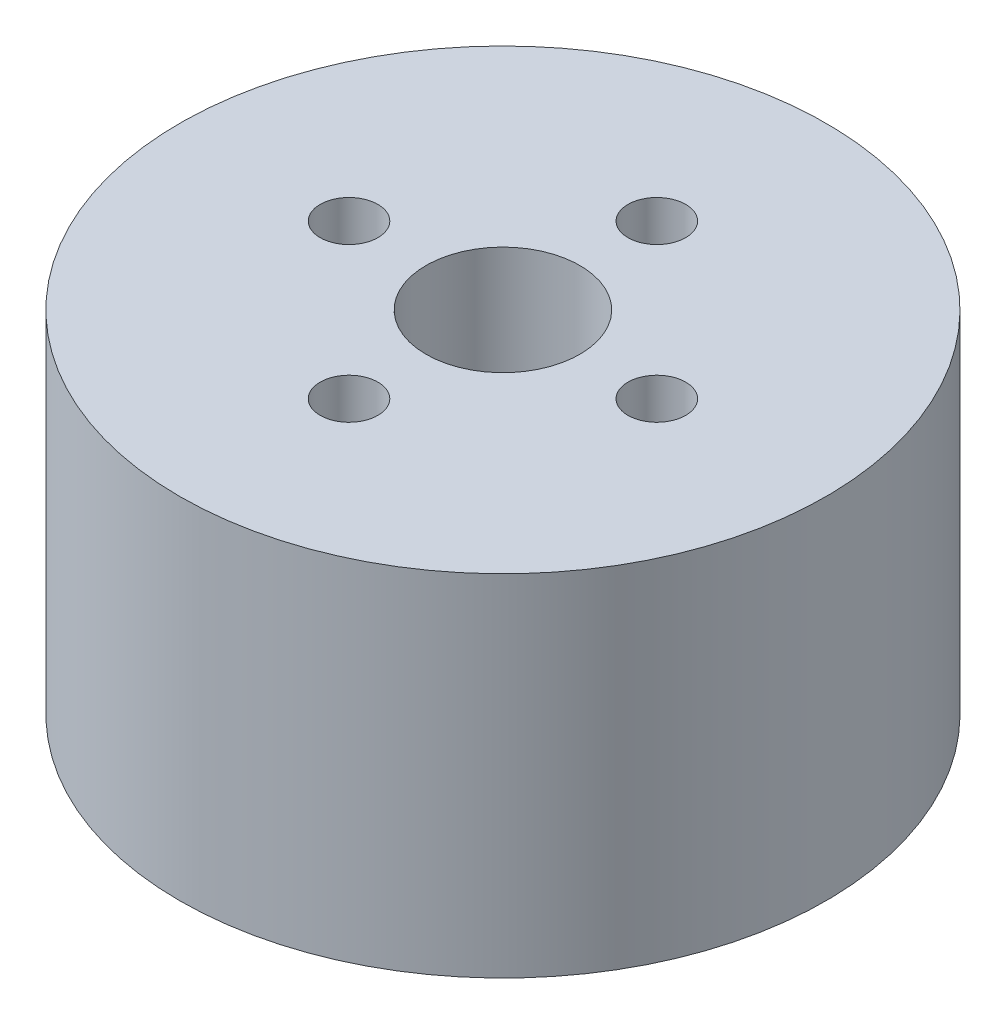
ISO-10303-21;
HEADER;
FILE_DESCRIPTION(('STEP AP214'),'2;1');
FILE_NAME('part.step','',(''),(''),'','','');
FILE_SCHEMA(('AUTOMOTIVE_DESIGN { 1 0 10303 214 1 1 1 1 }'));
ENDSEC;
DATA;
#1=APPLICATION_CONTEXT('core data for automotive mechanical design processes');
#2=APPLICATION_PROTOCOL_DEFINITION('international standard','automotive_design',2000,#1);
#3=PRODUCT_CONTEXT('',#1,'mechanical');
#4=PRODUCT('Part','Part','',(#3));
#5=PRODUCT_RELATED_PRODUCT_CATEGORY('part','',(#4));
#6=PRODUCT_DEFINITION_FORMATION('','',#4);
#7=PRODUCT_DEFINITION_CONTEXT('part definition',#1,'design');
#8=PRODUCT_DEFINITION('design','',#6,#7);
#9=PRODUCT_DEFINITION_SHAPE('','',#8);
#10=(LENGTH_UNIT() NAMED_UNIT(*) SI_UNIT(.MILLI.,.METRE.));
#11=(NAMED_UNIT(*) PLANE_ANGLE_UNIT() SI_UNIT($,.RADIAN.));
#12=(NAMED_UNIT(*) SI_UNIT($,.STERADIAN.) SOLID_ANGLE_UNIT());
#13=UNCERTAINTY_MEASURE_WITH_UNIT(LENGTH_MEASURE(1.E-05),#10,'distance_accuracy_value','');
#14=(GEOMETRIC_REPRESENTATION_CONTEXT(3) GLOBAL_UNCERTAINTY_ASSIGNED_CONTEXT((#13)) GLOBAL_UNIT_ASSIGNED_CONTEXT((#10,
#11,#12)) REPRESENTATION_CONTEXT('',''));
#15=CARTESIAN_POINT('',(0.,0.,0.));
#16=DIRECTION('',(0.,0.,1.));
#17=DIRECTION('',(1.,0.,0.));
#18=AXIS2_PLACEMENT_3D('',#15,#16,#17);
#19=CARTESIAN_POINT('',(0.,18.2,0.));
#20=DIRECTION('',(0.,-1.,0.));
#21=DIRECTION('',(0.,0.,-1.));
#22=AXIS2_PLACEMENT_3D('',#19,#20,#21);
#23=CYLINDRICAL_SURFACE('',#22,16.8);
#24=CARTESIAN_POINT('',(0.,18.2,0.));
#25=DIRECTION('',(0.,1.,0.));
#26=DIRECTION('',(0.,0.,1.));
#27=AXIS2_PLACEMENT_3D('',#24,#25,#26);
#28=CIRCLE('',#27,16.8);
#29=CARTESIAN_POINT('',(0.,18.2,16.8));
#30=VERTEX_POINT('',#29);
#31=EDGE_CURVE('E10',#30,#30,#28,.T.);
#32=ORIENTED_EDGE('',*,*,#31,.F.);
#33=EDGE_LOOP('',(#32));
#34=FACE_BOUND('',#33,.T.);
#35=CARTESIAN_POINT('',(0.,0.,0.));
#36=DIRECTION('',(0.,1.,0.));
#37=DIRECTION('',(0.,0.,1.));
#38=AXIS2_PLACEMENT_3D('',#35,#36,#37);
#39=CIRCLE('',#38,16.8);
#40=CARTESIAN_POINT('',(0.,0.,16.8));
#41=VERTEX_POINT('',#40);
#42=EDGE_CURVE('E40',#41,#41,#39,.T.);
#43=ORIENTED_EDGE('',*,*,#42,.T.);
#44=EDGE_LOOP('',(#43));
#45=FACE_BOUND('',#44,.T.);
#46=ADVANCED_FACE('F37',(#34,#45),#23,.T.);
#47=CARTESIAN_POINT('',(0.,18.2,0.));
#48=DIRECTION('',(0.,1.,0.));
#49=DIRECTION('',(0.,0.,1.));
#50=AXIS2_PLACEMENT_3D('',#47,#48,#49);
#51=PLANE('',#50);
#52=CARTESIAN_POINT('',(0.,18.2,-8.));
#53=DIRECTION('',(0.,1.,0.));
#54=DIRECTION('',(0.,0.,1.));
#55=AXIS2_PLACEMENT_3D('',#52,#53,#54);
#56=CIRCLE('',#55,1.5);
#57=CARTESIAN_POINT('',(0.,18.2,-6.5));
#58=VERTEX_POINT('',#57);
#59=EDGE_CURVE('E74',#58,#58,#56,.T.);
#60=ORIENTED_EDGE('',*,*,#59,.F.);
#61=EDGE_LOOP('',(#60));
#62=FACE_BOUND('',#61,.T.);
#63=CARTESIAN_POINT('',(8.,18.2,0.));
#64=DIRECTION('',(0.,1.,0.));
#65=DIRECTION('',(0.,0.,1.));
#66=AXIS2_PLACEMENT_3D('',#63,#64,#65);
#67=CIRCLE('',#66,1.5);
#68=CARTESIAN_POINT('',(8.,18.2,1.5));
#69=VERTEX_POINT('',#68);
#70=EDGE_CURVE('E68',#69,#69,#67,.T.);
#71=ORIENTED_EDGE('',*,*,#70,.F.);
#72=EDGE_LOOP('',(#71));
#73=FACE_BOUND('',#72,.T.);
#74=CARTESIAN_POINT('',(0.,18.2,8.));
#75=DIRECTION('',(0.,1.,0.));
#76=DIRECTION('',(0.,0.,1.));
#77=AXIS2_PLACEMENT_3D('',#74,#75,#76);
#78=CIRCLE('',#77,1.5);
#79=CARTESIAN_POINT('',(0.,18.2,9.5));
#80=VERTEX_POINT('',#79);
#81=EDGE_CURVE('E62',#80,#80,#78,.T.);
#82=ORIENTED_EDGE('',*,*,#81,.F.);
#83=EDGE_LOOP('',(#82));
#84=FACE_BOUND('',#83,.T.);
#85=CARTESIAN_POINT('',(-8.,18.2,0.));
#86=DIRECTION('',(0.,1.,0.));
#87=DIRECTION('',(0.,0.,1.));
#88=AXIS2_PLACEMENT_3D('',#85,#86,#87);
#89=CIRCLE('',#88,1.5);
#90=CARTESIAN_POINT('',(-8.,18.2,1.5));
#91=VERTEX_POINT('',#90);
#92=EDGE_CURVE('E55',#91,#91,#89,.T.);
#93=ORIENTED_EDGE('',*,*,#92,.F.);
#94=EDGE_LOOP('',(#93));
#95=FACE_BOUND('',#94,.T.);
#96=CARTESIAN_POINT('',(0.,18.2,0.));
#97=DIRECTION('',(0.,1.,0.));
#98=DIRECTION('',(0.,0.,1.));
#99=AXIS2_PLACEMENT_3D('',#96,#97,#98);
#100=CIRCLE('',#99,4.);
#101=CARTESIAN_POINT('',(0.,18.2,4.));
#102=VERTEX_POINT('',#101);
#103=EDGE_CURVE('E49',#102,#102,#100,.T.);
#104=ORIENTED_EDGE('',*,*,#103,.F.);
#105=EDGE_LOOP('',(#104));
#106=FACE_BOUND('',#105,.T.);
#107=ORIENTED_EDGE('',*,*,#31,.T.);
#108=EDGE_LOOP('',(#107));
#109=FACE_BOUND('',#108,.T.);
#110=ADVANCED_FACE('F116',(#62,#73,#84,#95,#106,#109),#51,.T.);
#111=CARTESIAN_POINT('',(0.,0.,0.));
#112=DIRECTION('',(0.,1.,0.));
#113=DIRECTION('',(0.,0.,1.));
#114=AXIS2_PLACEMENT_3D('',#111,#112,#113);
#115=PLANE('',#114);
#116=CARTESIAN_POINT('',(0.,0.,11.25));
#117=DIRECTION('',(0.,-1.,0.));
#118=DIRECTION('',(0.,0.,-1.));
#119=AXIS2_PLACEMENT_3D('',#116,#117,#118);
#120=CIRCLE('',#119,1.5);
#121=CARTESIAN_POINT('',(0.,0.,9.75));
#122=VERTEX_POINT('',#121);
#123=EDGE_CURVE('E97',#122,#122,#120,.T.);
#124=ORIENTED_EDGE('',*,*,#123,.F.);
#125=EDGE_LOOP('',(#124));
#126=FACE_BOUND('',#125,.T.);
#127=CARTESIAN_POINT('',(11.25,0.,0.));
#128=DIRECTION('',(0.,-1.,0.));
#129=DIRECTION('',(0.,0.,-1.));
#130=AXIS2_PLACEMENT_3D('',#127,#128,#129);
#131=CIRCLE('',#130,1.5000000000004);
#132=CARTESIAN_POINT('',(11.25,0.,-1.50000000000039));
#133=VERTEX_POINT('',#132);
#134=EDGE_CURVE('E91',#133,#133,#131,.T.);
#135=ORIENTED_EDGE('',*,*,#134,.F.);
#136=EDGE_LOOP('',(#135));
#137=FACE_BOUND('',#136,.T.);
#138=CARTESIAN_POINT('',(0.,0.,-11.25));
#139=DIRECTION('',(0.,-1.,0.));
#140=DIRECTION('',(0.,0.,-1.));
#141=AXIS2_PLACEMENT_3D('',#138,#139,#140);
#142=CIRCLE('',#141,1.50000000000061);
#143=CARTESIAN_POINT('',(0.,0.,-12.7500000000006));
#144=VERTEX_POINT('',#143);
#145=EDGE_CURVE('E85',#144,#144,#142,.T.);
#146=ORIENTED_EDGE('',*,*,#145,.F.);
#147=EDGE_LOOP('',(#146));
#148=FACE_BOUND('',#147,.T.);
#149=CARTESIAN_POINT('',(-11.25,0.,0.));
#150=DIRECTION('',(0.,-1.,0.));
#151=DIRECTION('',(0.,0.,-1.));
#152=AXIS2_PLACEMENT_3D('',#149,#150,#151);
#153=CIRCLE('',#152,1.50000000000021);
#154=CARTESIAN_POINT('',(-11.25,0.,-1.50000000000021));
#155=VERTEX_POINT('',#154);
#156=EDGE_CURVE('E79',#155,#155,#153,.T.);
#157=ORIENTED_EDGE('',*,*,#156,.F.);
#158=EDGE_LOOP('',(#157));
#159=FACE_BOUND('',#158,.T.);
#160=CARTESIAN_POINT('',(0.,0.,0.));
#161=DIRECTION('',(0.,1.,0.));
#162=DIRECTION('',(0.,0.,1.));
#163=AXIS2_PLACEMENT_3D('',#160,#161,#162);
#164=CIRCLE('',#163,4.);
#165=CARTESIAN_POINT('',(0.,0.,4.));
#166=VERTEX_POINT('',#165);
#167=EDGE_CURVE('E47',#166,#166,#164,.T.);
#168=ORIENTED_EDGE('',*,*,#167,.T.);
#169=EDGE_LOOP('',(#168));
#170=FACE_BOUND('',#169,.T.);
#171=ORIENTED_EDGE('',*,*,#42,.F.);
#172=EDGE_LOOP('',(#171));
#173=FACE_BOUND('',#172,.T.);
#174=ADVANCED_FACE('F112',(#126,#137,#148,#159,#170,#173),#115,.F.);
#175=CARTESIAN_POINT('',(0.,0.,0.));
#176=DIRECTION('',(0.,1.,0.));
#177=DIRECTION('',(0.,0.,1.));
#178=AXIS2_PLACEMENT_3D('',#175,#176,#177);
#179=CYLINDRICAL_SURFACE('',#178,4.);
#180=ORIENTED_EDGE('',*,*,#167,.F.);
#181=EDGE_LOOP('',(#180));
#182=FACE_BOUND('',#181,.T.);
#183=ORIENTED_EDGE('',*,*,#103,.T.);
#184=EDGE_LOOP('',(#183));
#185=FACE_BOUND('',#184,.T.);
#186=ADVANCED_FACE('F115',(#182,#185),#179,.F.);
#187=CARTESIAN_POINT('',(-8.,13.2,0.));
#188=DIRECTION('',(0.,1.,0.));
#189=DIRECTION('',(0.,0.,1.));
#190=AXIS2_PLACEMENT_3D('',#187,#188,#189);
#191=CYLINDRICAL_SURFACE('',#190,1.5);
#192=CARTESIAN_POINT('',(-8.,13.2,0.));
#193=DIRECTION('',(0.,1.,0.));
#194=DIRECTION('',(0.,0.,1.));
#195=AXIS2_PLACEMENT_3D('',#192,#193,#194);
#196=CIRCLE('',#195,1.5);
#197=CARTESIAN_POINT('',(-8.,13.2,1.5));
#198=VERTEX_POINT('',#197);
#199=EDGE_CURVE('E58',#198,#198,#196,.T.);
#200=ORIENTED_EDGE('',*,*,#199,.F.);
#201=EDGE_LOOP('',(#200));
#202=FACE_BOUND('',#201,.T.);
#203=ORIENTED_EDGE('',*,*,#92,.T.);
#204=EDGE_LOOP('',(#203));
#205=FACE_BOUND('',#204,.T.);
#206=ADVANCED_FACE('F141',(#202,#205),#191,.F.);
#207=CARTESIAN_POINT('',(-8.,13.2,0.));
#208=DIRECTION('',(0.,1.,0.));
#209=DIRECTION('',(0.,0.,1.));
#210=AXIS2_PLACEMENT_3D('',#207,#208,#209);
#211=PLANE('',#210);
#212=ORIENTED_EDGE('',*,*,#199,.T.);
#213=EDGE_LOOP('',(#212));
#214=FACE_BOUND('',#213,.T.);
#215=ADVANCED_FACE('F145',(#214),#211,.T.);
#216=CARTESIAN_POINT('',(0.,13.2,8.));
#217=DIRECTION('',(0.,1.,0.));
#218=DIRECTION('',(0.,0.,1.));
#219=AXIS2_PLACEMENT_3D('',#216,#217,#218);
#220=CYLINDRICAL_SURFACE('',#219,1.5);
#221=CARTESIAN_POINT('',(0.,13.2,8.));
#222=DIRECTION('',(0.,1.,0.));
#223=DIRECTION('',(0.,0.,1.));
#224=AXIS2_PLACEMENT_3D('',#221,#222,#223);
#225=CIRCLE('',#224,1.5);
#226=CARTESIAN_POINT('',(0.,13.2,9.5));
#227=VERTEX_POINT('',#226);
#228=EDGE_CURVE('E65',#227,#227,#225,.T.);
#229=ORIENTED_EDGE('',*,*,#228,.F.);
#230=EDGE_LOOP('',(#229));
#231=FACE_BOUND('',#230,.T.);
#232=ORIENTED_EDGE('',*,*,#81,.T.);
#233=EDGE_LOOP('',(#232));
#234=FACE_BOUND('',#233,.T.);
#235=ADVANCED_FACE('F149',(#231,#234),#220,.F.);
#236=CARTESIAN_POINT('',(0.,13.2,8.));
#237=DIRECTION('',(0.,1.,0.));
#238=DIRECTION('',(0.,0.,1.));
#239=AXIS2_PLACEMENT_3D('',#236,#237,#238);
#240=PLANE('',#239);
#241=ORIENTED_EDGE('',*,*,#228,.T.);
#242=EDGE_LOOP('',(#241));
#243=FACE_BOUND('',#242,.T.);
#244=ADVANCED_FACE('F153',(#243),#240,.T.);
#245=CARTESIAN_POINT('',(8.,13.2,0.));
#246=DIRECTION('',(0.,1.,0.));
#247=DIRECTION('',(0.,0.,1.));
#248=AXIS2_PLACEMENT_3D('',#245,#246,#247);
#249=CYLINDRICAL_SURFACE('',#248,1.5);
#250=CARTESIAN_POINT('',(8.,13.2,0.));
#251=DIRECTION('',(0.,1.,0.));
#252=DIRECTION('',(0.,0.,1.));
#253=AXIS2_PLACEMENT_3D('',#250,#251,#252);
#254=CIRCLE('',#253,1.5);
#255=CARTESIAN_POINT('',(8.,13.2,1.5));
#256=VERTEX_POINT('',#255);
#257=EDGE_CURVE('E71',#256,#256,#254,.T.);
#258=ORIENTED_EDGE('',*,*,#257,.F.);
#259=EDGE_LOOP('',(#258));
#260=FACE_BOUND('',#259,.T.);
#261=ORIENTED_EDGE('',*,*,#70,.T.);
#262=EDGE_LOOP('',(#261));
#263=FACE_BOUND('',#262,.T.);
#264=ADVANCED_FACE('F157',(#260,#263),#249,.F.);
#265=CARTESIAN_POINT('',(8.,13.2,0.));
#266=DIRECTION('',(0.,1.,0.));
#267=DIRECTION('',(0.,0.,1.));
#268=AXIS2_PLACEMENT_3D('',#265,#266,#267);
#269=PLANE('',#268);
#270=ORIENTED_EDGE('',*,*,#257,.T.);
#271=EDGE_LOOP('',(#270));
#272=FACE_BOUND('',#271,.T.);
#273=ADVANCED_FACE('F161',(#272),#269,.T.);
#274=CARTESIAN_POINT('',(0.,13.2,-8.));
#275=DIRECTION('',(0.,1.,0.));
#276=DIRECTION('',(0.,0.,1.));
#277=AXIS2_PLACEMENT_3D('',#274,#275,#276);
#278=CYLINDRICAL_SURFACE('',#277,1.5);
#279=CARTESIAN_POINT('',(0.,13.2,-8.));
#280=DIRECTION('',(0.,1.,0.));
#281=DIRECTION('',(0.,0.,1.));
#282=AXIS2_PLACEMENT_3D('',#279,#280,#281);
#283=CIRCLE('',#282,1.5);
#284=CARTESIAN_POINT('',(0.,13.2,-6.5));
#285=VERTEX_POINT('',#284);
#286=EDGE_CURVE('E52',#285,#285,#283,.T.);
#287=ORIENTED_EDGE('',*,*,#286,.F.);
#288=EDGE_LOOP('',(#287));
#289=FACE_BOUND('',#288,.T.);
#290=ORIENTED_EDGE('',*,*,#59,.T.);
#291=EDGE_LOOP('',(#290));
#292=FACE_BOUND('',#291,.T.);
#293=ADVANCED_FACE('F165',(#289,#292),#278,.F.);
#294=CARTESIAN_POINT('',(0.,13.2,-8.));
#295=DIRECTION('',(0.,1.,0.));
#296=DIRECTION('',(0.,0.,1.));
#297=AXIS2_PLACEMENT_3D('',#294,#295,#296);
#298=PLANE('',#297);
#299=ORIENTED_EDGE('',*,*,#286,.T.);
#300=EDGE_LOOP('',(#299));
#301=FACE_BOUND('',#300,.T.);
#302=ADVANCED_FACE('F169',(#301),#298,.T.);
#303=CARTESIAN_POINT('',(-11.25,5.,0.));
#304=DIRECTION('',(0.,-1.,0.));
#305=DIRECTION('',(0.,0.,-1.));
#306=AXIS2_PLACEMENT_3D('',#303,#304,#305);
#307=CYLINDRICAL_SURFACE('',#306,1.50000000000021);
#308=CARTESIAN_POINT('',(-11.25,5.,0.));
#309=DIRECTION('',(0.,-1.,0.));
#310=DIRECTION('',(0.,0.,-1.));
#311=AXIS2_PLACEMENT_3D('',#308,#309,#310);
#312=CIRCLE('',#311,1.50000000000021);
#313=CARTESIAN_POINT('',(-11.25,5.,-1.50000000000021));
#314=VERTEX_POINT('',#313);
#315=EDGE_CURVE('E82',#314,#314,#312,.T.);
#316=ORIENTED_EDGE('',*,*,#315,.F.);
#317=EDGE_LOOP('',(#316));
#318=FACE_BOUND('',#317,.T.);
#319=ORIENTED_EDGE('',*,*,#156,.T.);
#320=EDGE_LOOP('',(#319));
#321=FACE_BOUND('',#320,.T.);
#322=ADVANCED_FACE('F173',(#318,#321),#307,.F.);
#323=CARTESIAN_POINT('',(-11.25,5.,0.));
#324=DIRECTION('',(0.,-1.,0.));
#325=DIRECTION('',(0.,0.,-1.));
#326=AXIS2_PLACEMENT_3D('',#323,#324,#325);
#327=PLANE('',#326);
#328=ORIENTED_EDGE('',*,*,#315,.T.);
#329=EDGE_LOOP('',(#328));
#330=FACE_BOUND('',#329,.T.);
#331=ADVANCED_FACE('F177',(#330),#327,.T.);
#332=CARTESIAN_POINT('',(0.,5.,-11.25));
#333=DIRECTION('',(0.,-1.,0.));
#334=DIRECTION('',(0.,0.,-1.));
#335=AXIS2_PLACEMENT_3D('',#332,#333,#334);
#336=CYLINDRICAL_SURFACE('',#335,1.50000000000061);
#337=CARTESIAN_POINT('',(0.,5.,-11.25));
#338=DIRECTION('',(0.,-1.,0.));
#339=DIRECTION('',(0.,0.,-1.));
#340=AXIS2_PLACEMENT_3D('',#337,#338,#339);
#341=CIRCLE('',#340,1.50000000000061);
#342=CARTESIAN_POINT('',(0.,5.,-12.7500000000006));
#343=VERTEX_POINT('',#342);
#344=EDGE_CURVE('E88',#343,#343,#341,.T.);
#345=ORIENTED_EDGE('',*,*,#344,.F.);
#346=EDGE_LOOP('',(#345));
#347=FACE_BOUND('',#346,.T.);
#348=ORIENTED_EDGE('',*,*,#145,.T.);
#349=EDGE_LOOP('',(#348));
#350=FACE_BOUND('',#349,.T.);
#351=ADVANCED_FACE('F181',(#347,#350),#336,.F.);
#352=CARTESIAN_POINT('',(0.,5.,-11.25));
#353=DIRECTION('',(0.,-1.,0.));
#354=DIRECTION('',(0.,0.,-1.));
#355=AXIS2_PLACEMENT_3D('',#352,#353,#354);
#356=PLANE('',#355);
#357=ORIENTED_EDGE('',*,*,#344,.T.);
#358=EDGE_LOOP('',(#357));
#359=FACE_BOUND('',#358,.T.);
#360=ADVANCED_FACE('F185',(#359),#356,.T.);
#361=CARTESIAN_POINT('',(11.25,5.,0.));
#362=DIRECTION('',(0.,-1.,0.));
#363=DIRECTION('',(0.,0.,-1.));
#364=AXIS2_PLACEMENT_3D('',#361,#362,#363);
#365=CYLINDRICAL_SURFACE('',#364,1.5000000000004);
#366=CARTESIAN_POINT('',(11.25,5.,0.));
#367=DIRECTION('',(0.,-1.,0.));
#368=DIRECTION('',(0.,0.,-1.));
#369=AXIS2_PLACEMENT_3D('',#366,#367,#368);
#370=CIRCLE('',#369,1.5000000000004);
#371=CARTESIAN_POINT('',(11.25,5.,-1.50000000000039));
#372=VERTEX_POINT('',#371);
#373=EDGE_CURVE('E94',#372,#372,#370,.T.);
#374=ORIENTED_EDGE('',*,*,#373,.F.);
#375=EDGE_LOOP('',(#374));
#376=FACE_BOUND('',#375,.T.);
#377=ORIENTED_EDGE('',*,*,#134,.T.);
#378=EDGE_LOOP('',(#377));
#379=FACE_BOUND('',#378,.T.);
#380=ADVANCED_FACE('F189',(#376,#379),#365,.F.);
#381=CARTESIAN_POINT('',(11.25,5.,0.));
#382=DIRECTION('',(0.,-1.,0.));
#383=DIRECTION('',(0.,0.,-1.));
#384=AXIS2_PLACEMENT_3D('',#381,#382,#383);
#385=PLANE('',#384);
#386=ORIENTED_EDGE('',*,*,#373,.T.);
#387=EDGE_LOOP('',(#386));
#388=FACE_BOUND('',#387,.T.);
#389=ADVANCED_FACE('F108',(#388),#385,.T.);
#390=CARTESIAN_POINT('',(0.,5.,11.25));
#391=DIRECTION('',(0.,-1.,0.));
#392=DIRECTION('',(0.,0.,-1.));
#393=AXIS2_PLACEMENT_3D('',#390,#391,#392);
#394=CYLINDRICAL_SURFACE('',#393,1.5);
#395=CARTESIAN_POINT('',(0.,5.,11.25));
#396=DIRECTION('',(0.,-1.,0.));
#397=DIRECTION('',(0.,0.,-1.));
#398=AXIS2_PLACEMENT_3D('',#395,#396,#397);
#399=CIRCLE('',#398,1.5);
#400=CARTESIAN_POINT('',(0.,5.,9.75));
#401=VERTEX_POINT('',#400);
#402=EDGE_CURVE('E59',#401,#401,#399,.T.);
#403=ORIENTED_EDGE('',*,*,#402,.F.);
#404=EDGE_LOOP('',(#403));
#405=FACE_BOUND('',#404,.T.);
#406=ORIENTED_EDGE('',*,*,#123,.T.);
#407=EDGE_LOOP('',(#406));
#408=FACE_BOUND('',#407,.T.);
#409=ADVANCED_FACE('F105',(#405,#408),#394,.F.);
#410=CARTESIAN_POINT('',(0.,5.,11.25));
#411=DIRECTION('',(0.,-1.,0.));
#412=DIRECTION('',(0.,0.,-1.));
#413=AXIS2_PLACEMENT_3D('',#410,#411,#412);
#414=PLANE('',#413);
#415=ORIENTED_EDGE('',*,*,#402,.T.);
#416=EDGE_LOOP('',(#415));
#417=FACE_BOUND('',#416,.T.);
#418=ADVANCED_FACE('F103',(#417),#414,.T.);
#419=CLOSED_SHELL('',(#46,#110,#174,#186,#206,#215,#235,#244,#264,#273,#293,#302,#322,#331,#351,
#360,#380,#389,#409,#418));
#420=MANIFOLD_SOLID_BREP('B2',#419);
#421=ADVANCED_BREP_SHAPE_REPRESENTATION('',(#18,#420),#14);
#422=SHAPE_DEFINITION_REPRESENTATION(#9,#421);
ENDSEC;
END-ISO-10303-21;
